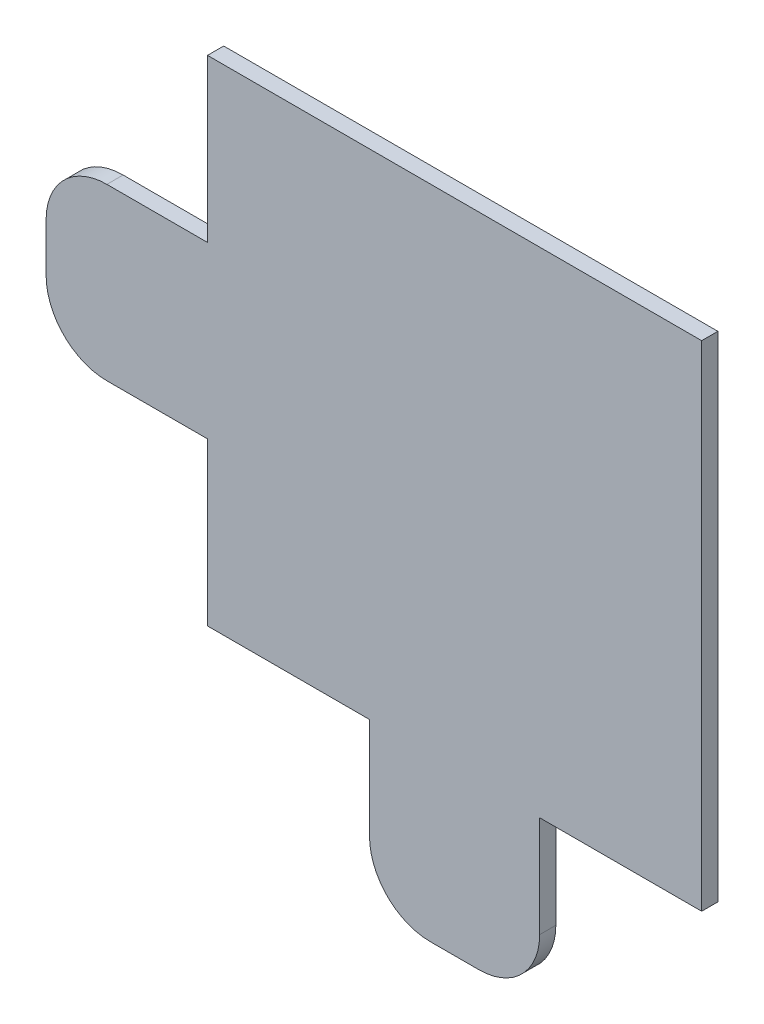
ISO-10303-21;
HEADER;
FILE_DESCRIPTION(('STEP AP214'),'2;1');
FILE_NAME('part.step','',(''),(''),'','','');
FILE_SCHEMA(('AUTOMOTIVE_DESIGN { 1 0 10303 214 1 1 1 1 }'));
ENDSEC;
DATA;
#1=APPLICATION_CONTEXT('core data for automotive mechanical design processes');
#2=APPLICATION_PROTOCOL_DEFINITION('international standard','automotive_design',2000,#1);
#3=PRODUCT_CONTEXT('',#1,'mechanical');
#4=PRODUCT('Part','Part','',(#3));
#5=PRODUCT_RELATED_PRODUCT_CATEGORY('part','',(#4));
#6=PRODUCT_DEFINITION_FORMATION('','',#4);
#7=PRODUCT_DEFINITION_CONTEXT('part definition',#1,'design');
#8=PRODUCT_DEFINITION('design','',#6,#7);
#9=PRODUCT_DEFINITION_SHAPE('','',#8);
#10=(LENGTH_UNIT() NAMED_UNIT(*) SI_UNIT(.MILLI.,.METRE.));
#11=(NAMED_UNIT(*) PLANE_ANGLE_UNIT() SI_UNIT($,.RADIAN.));
#12=(NAMED_UNIT(*) SI_UNIT($,.STERADIAN.) SOLID_ANGLE_UNIT());
#13=UNCERTAINTY_MEASURE_WITH_UNIT(LENGTH_MEASURE(1.E-05),#10,'distance_accuracy_value','');
#14=(GEOMETRIC_REPRESENTATION_CONTEXT(3) GLOBAL_UNCERTAINTY_ASSIGNED_CONTEXT((#13)) GLOBAL_UNIT_ASSIGNED_CONTEXT((#10,
#11,#12)) REPRESENTATION_CONTEXT('',''));
#15=CARTESIAN_POINT('',(0.,0.,0.));
#16=DIRECTION('',(0.,0.,1.));
#17=DIRECTION('',(1.,0.,0.));
#18=AXIS2_PLACEMENT_3D('',#15,#16,#17);
#19=CARTESIAN_POINT('',(-0.305,0.325,0.01));
#20=DIRECTION('',(0.,-1.,0.));
#21=DIRECTION('',(0.,0.,-1.));
#22=AXIS2_PLACEMENT_3D('',#19,#20,#21);
#23=PLANE('',#22);
#24=DIRECTION('',(-1.,0.,0.));
#25=VECTOR('',#24,1.);
#26=CARTESIAN_POINT('',(-0.305,0.325,-0.01));
#27=LINE('',#26,#25);
#28=CARTESIAN_POINT('',(0.305,0.325,-0.01));
#29=VERTEX_POINT('',#28);
#30=CARTESIAN_POINT('',(-0.305,0.325,-0.01));
#31=VERTEX_POINT('',#30);
#32=EDGE_CURVE('E177',#29,#31,#27,.T.);
#33=ORIENTED_EDGE('',*,*,#32,.T.);
#34=DIRECTION('',(0.,0.,-1.));
#35=VECTOR('',#34,1.);
#36=CARTESIAN_POINT('',(-0.305,0.325,0.01));
#37=LINE('',#36,#35);
#38=CARTESIAN_POINT('',(-0.305,0.325,0.01));
#39=VERTEX_POINT('',#38);
#40=EDGE_CURVE('E11',#39,#31,#37,.T.);
#41=ORIENTED_EDGE('',*,*,#40,.F.);
#42=DIRECTION('',(-1.,0.,0.));
#43=VECTOR('',#42,1.);
#44=CARTESIAN_POINT('',(-0.305,0.325,0.01));
#45=LINE('',#44,#43);
#46=CARTESIAN_POINT('',(0.305,0.325,0.01));
#47=VERTEX_POINT('',#46);
#48=EDGE_CURVE('E207',#47,#39,#45,.T.);
#49=ORIENTED_EDGE('',*,*,#48,.F.);
#50=DIRECTION('',(0.,0.,-1.));
#51=VECTOR('',#50,1.);
#52=CARTESIAN_POINT('',(0.305,0.325,0.01));
#53=LINE('',#52,#51);
#54=EDGE_CURVE('E173',#47,#29,#53,.T.);
#55=ORIENTED_EDGE('',*,*,#54,.T.);
#56=EDGE_LOOP('',(#33,#41,#49,#55));
#57=FACE_BOUND('',#56,.T.);
#58=ADVANCED_FACE('F33',(#57),#23,.F.);
#59=CARTESIAN_POINT('',(-0.305,0.325,0.01));
#60=DIRECTION('',(1.,0.,0.));
#61=DIRECTION('',(0.,0.,-1.));
#62=AXIS2_PLACEMENT_3D('',#59,#60,#61);
#63=PLANE('',#62);
#64=DIRECTION('',(0.,-1.,0.));
#65=VECTOR('',#64,1.);
#66=CARTESIAN_POINT('',(-0.305,0.325,-0.01));
#67=LINE('',#66,#65);
#68=CARTESIAN_POINT('',(-0.305,0.125,-0.01));
#69=VERTEX_POINT('',#68);
#70=EDGE_CURVE('E180',#31,#69,#67,.T.);
#71=ORIENTED_EDGE('',*,*,#70,.T.);
#72=DIRECTION('',(0.,0.,-1.));
#73=VECTOR('',#72,1.);
#74=CARTESIAN_POINT('',(-0.305,0.125,0.01));
#75=LINE('',#74,#73);
#76=CARTESIAN_POINT('',(-0.305,0.125,0.01));
#77=VERTEX_POINT('',#76);
#78=EDGE_CURVE('E41',#77,#69,#75,.T.);
#79=ORIENTED_EDGE('',*,*,#78,.F.);
#80=DIRECTION('',(0.,-1.,0.));
#81=VECTOR('',#80,1.);
#82=CARTESIAN_POINT('',(-0.305,0.325,0.01));
#83=LINE('',#82,#81);
#84=EDGE_CURVE('E116',#39,#77,#83,.T.);
#85=ORIENTED_EDGE('',*,*,#84,.F.);
#86=ORIENTED_EDGE('',*,*,#40,.T.);
#87=EDGE_LOOP('',(#71,#79,#85,#86));
#88=FACE_BOUND('',#87,.T.);
#89=ADVANCED_FACE('F305',(#88),#63,.F.);
#90=CARTESIAN_POINT('',(-0.429197649487811,0.125,0.01));
#91=DIRECTION('',(0.,-1.,0.));
#92=DIRECTION('',(0.,0.,-1.));
#93=AXIS2_PLACEMENT_3D('',#90,#91,#92);
#94=PLANE('',#93);
#95=DIRECTION('',(-1.,0.,0.));
#96=VECTOR('',#95,1.);
#97=CARTESIAN_POINT('',(-0.429197649487811,0.125,-0.01));
#98=LINE('',#97,#96);
#99=CARTESIAN_POINT('',(-0.429197649487811,0.125,-0.01));
#100=VERTEX_POINT('',#99);
#101=EDGE_CURVE('E182',#69,#100,#98,.T.);
#102=ORIENTED_EDGE('',*,*,#101,.T.);
#103=DIRECTION('',(0.,0.,-1.));
#104=VECTOR('',#103,1.);
#105=CARTESIAN_POINT('',(-0.429197649487811,0.125,0.01));
#106=LINE('',#105,#104);
#107=CARTESIAN_POINT('',(-0.429197649487811,0.125,0.01));
#108=VERTEX_POINT('',#107);
#109=EDGE_CURVE('E238',#108,#100,#106,.T.);
#110=ORIENTED_EDGE('',*,*,#109,.F.);
#111=DIRECTION('',(-1.,0.,0.));
#112=VECTOR('',#111,1.);
#113=CARTESIAN_POINT('',(-0.429197649487811,0.125,0.01));
#114=LINE('',#113,#112);
#115=EDGE_CURVE('E246',#77,#108,#114,.T.);
#116=ORIENTED_EDGE('',*,*,#115,.F.);
#117=ORIENTED_EDGE('',*,*,#78,.T.);
#118=EDGE_LOOP('',(#102,#110,#116,#117));
#119=FACE_BOUND('',#118,.T.);
#120=ADVANCED_FACE('F244',(#119),#94,.F.);
#121=CARTESIAN_POINT('',(-0.429197649487811,0.05,0.01));
#122=DIRECTION('',(0.,0.,-1.));
#123=DIRECTION('',(-1.,0.,0.));
#124=AXIS2_PLACEMENT_3D('',#121,#122,#123);
#125=CYLINDRICAL_SURFACE('',#124,0.075);
#126=CARTESIAN_POINT('',(-0.429197649487811,0.05,-0.01));
#127=DIRECTION('',(0.,0.,1.));
#128=DIRECTION('',(-1.,0.,0.));
#129=AXIS2_PLACEMENT_3D('',#126,#127,#128);
#130=CIRCLE('',#129,0.075);
#131=CARTESIAN_POINT('',(-0.504197649487811,0.05,-0.01));
#132=VERTEX_POINT('',#131);
#133=EDGE_CURVE('E184',#100,#132,#130,.T.);
#134=ORIENTED_EDGE('',*,*,#133,.T.);
#135=DIRECTION('',(0.,0.,-1.));
#136=VECTOR('',#135,1.);
#137=CARTESIAN_POINT('',(-0.504197649487811,0.05,0.01));
#138=LINE('',#137,#136);
#139=CARTESIAN_POINT('',(-0.504197649487811,0.05,0.01));
#140=VERTEX_POINT('',#139);
#141=EDGE_CURVE('E235',#140,#132,#138,.T.);
#142=ORIENTED_EDGE('',*,*,#141,.F.);
#143=CARTESIAN_POINT('',(-0.429197649487811,0.05,0.01));
#144=DIRECTION('',(0.,0.,1.));
#145=DIRECTION('',(-1.,0.,0.));
#146=AXIS2_PLACEMENT_3D('',#143,#144,#145);
#147=CIRCLE('',#146,0.075);
#148=EDGE_CURVE('E264',#108,#140,#147,.T.);
#149=ORIENTED_EDGE('',*,*,#148,.F.);
#150=ORIENTED_EDGE('',*,*,#109,.T.);
#151=EDGE_LOOP('',(#134,#142,#149,#150));
#152=FACE_BOUND('',#151,.T.);
#153=ADVANCED_FACE('F255',(#152),#125,.T.);
#154=CARTESIAN_POINT('',(-0.504197649487811,0.05,0.01));
#155=DIRECTION('',(1.,0.,0.));
#156=DIRECTION('',(0.,1.,0.));
#157=AXIS2_PLACEMENT_3D('',#154,#155,#156);
#158=PLANE('',#157);
#159=DIRECTION('',(0.,-1.,0.));
#160=VECTOR('',#159,1.);
#161=CARTESIAN_POINT('',(-0.504197649487811,0.05,-0.01));
#162=LINE('',#161,#160);
#163=CARTESIAN_POINT('',(-0.504197649487811,-0.00999999999999997,-0.01));
#164=VERTEX_POINT('',#163);
#165=EDGE_CURVE('E186',#132,#164,#162,.T.);
#166=ORIENTED_EDGE('',*,*,#165,.T.);
#167=DIRECTION('',(0.,0.,-1.));
#168=VECTOR('',#167,1.);
#169=CARTESIAN_POINT('',(-0.504197649487811,-0.00999999999999997,0.01));
#170=LINE('',#169,#168);
#171=CARTESIAN_POINT('',(-0.504197649487811,-0.00999999999999997,0.01));
#172=VERTEX_POINT('',#171);
#173=EDGE_CURVE('E232',#172,#164,#170,.T.);
#174=ORIENTED_EDGE('',*,*,#173,.F.);
#175=DIRECTION('',(0.,-1.,0.));
#176=VECTOR('',#175,1.);
#177=CARTESIAN_POINT('',(-0.504197649487811,0.05,0.01));
#178=LINE('',#177,#176);
#179=EDGE_CURVE('E261',#140,#172,#178,.T.);
#180=ORIENTED_EDGE('',*,*,#179,.F.);
#181=ORIENTED_EDGE('',*,*,#141,.T.);
#182=EDGE_LOOP('',(#166,#174,#180,#181));
#183=FACE_BOUND('',#182,.T.);
#184=ADVANCED_FACE('F259',(#183),#158,.F.);
#185=CARTESIAN_POINT('',(-0.429197649487811,-0.00999999999999997,0.01));
#186=DIRECTION('',(0.,0.,-1.));
#187=DIRECTION('',(-1.,0.,0.));
#188=AXIS2_PLACEMENT_3D('',#185,#186,#187);
#189=CYLINDRICAL_SURFACE('',#188,0.075);
#190=CARTESIAN_POINT('',(-0.429197649487811,-0.00999999999999997,-0.01));
#191=DIRECTION('',(0.,0.,1.));
#192=DIRECTION('',(-1.,0.,0.));
#193=AXIS2_PLACEMENT_3D('',#190,#191,#192);
#194=CIRCLE('',#193,0.075);
#195=CARTESIAN_POINT('',(-0.429197649487811,-0.085,-0.01));
#196=VERTEX_POINT('',#195);
#197=EDGE_CURVE('E188',#164,#196,#194,.T.);
#198=ORIENTED_EDGE('',*,*,#197,.T.);
#199=DIRECTION('',(0.,0.,-1.));
#200=VECTOR('',#199,1.);
#201=CARTESIAN_POINT('',(-0.429197649487811,-0.085,0.01));
#202=LINE('',#201,#200);
#203=CARTESIAN_POINT('',(-0.429197649487811,-0.085,0.01));
#204=VERTEX_POINT('',#203);
#205=EDGE_CURVE('E229',#204,#196,#202,.T.);
#206=ORIENTED_EDGE('',*,*,#205,.F.);
#207=CARTESIAN_POINT('',(-0.429197649487811,-0.00999999999999997,0.01));
#208=DIRECTION('',(0.,0.,1.));
#209=DIRECTION('',(-1.,0.,0.));
#210=AXIS2_PLACEMENT_3D('',#207,#208,#209);
#211=CIRCLE('',#210,0.075);
#212=EDGE_CURVE('E263',#172,#204,#211,.T.);
#213=ORIENTED_EDGE('',*,*,#212,.F.);
#214=ORIENTED_EDGE('',*,*,#173,.T.);
#215=EDGE_LOOP('',(#198,#206,#213,#214));
#216=FACE_BOUND('',#215,.T.);
#217=ADVANCED_FACE('F318',(#216),#189,.T.);
#218=CARTESIAN_POINT('',(-0.429197649487811,-0.085,0.01));
#219=DIRECTION('',(0.,1.,0.));
#220=DIRECTION('',(-1.,0.,0.));
#221=AXIS2_PLACEMENT_3D('',#218,#219,#220);
#222=PLANE('',#221);
#223=DIRECTION('',(1.,0.,0.));
#224=VECTOR('',#223,1.);
#225=CARTESIAN_POINT('',(-0.429197649487811,-0.085,-0.01));
#226=LINE('',#225,#224);
#227=CARTESIAN_POINT('',(-0.305,-0.085,-0.01));
#228=VERTEX_POINT('',#227);
#229=EDGE_CURVE('E190',#196,#228,#226,.T.);
#230=ORIENTED_EDGE('',*,*,#229,.T.);
#231=DIRECTION('',(0.,0.,-1.));
#232=VECTOR('',#231,1.);
#233=CARTESIAN_POINT('',(-0.305,-0.085,0.01));
#234=LINE('',#233,#232);
#235=CARTESIAN_POINT('',(-0.305,-0.085,0.01));
#236=VERTEX_POINT('',#235);
#237=EDGE_CURVE('E226',#236,#228,#234,.T.);
#238=ORIENTED_EDGE('',*,*,#237,.F.);
#239=DIRECTION('',(1.,0.,0.));
#240=VECTOR('',#239,1.);
#241=CARTESIAN_POINT('',(-0.429197649487811,-0.085,0.01));
#242=LINE('',#241,#240);
#243=EDGE_CURVE('E266',#204,#236,#242,.T.);
#244=ORIENTED_EDGE('',*,*,#243,.F.);
#245=ORIENTED_EDGE('',*,*,#205,.T.);
#246=EDGE_LOOP('',(#230,#238,#244,#245));
#247=FACE_BOUND('',#246,.T.);
#248=ADVANCED_FACE('F321',(#247),#222,.F.);
#249=CARTESIAN_POINT('',(-0.305,-0.085,0.01));
#250=DIRECTION('',(1.,0.,0.));
#251=DIRECTION('',(0.,0.,-1.));
#252=AXIS2_PLACEMENT_3D('',#249,#250,#251);
#253=PLANE('',#252);
#254=DIRECTION('',(0.,-1.,0.));
#255=VECTOR('',#254,1.);
#256=CARTESIAN_POINT('',(-0.305,-0.085,-0.01));
#257=LINE('',#256,#255);
#258=CARTESIAN_POINT('',(-0.305,-0.285,-0.01));
#259=VERTEX_POINT('',#258);
#260=EDGE_CURVE('E192',#228,#259,#257,.T.);
#261=ORIENTED_EDGE('',*,*,#260,.T.);
#262=DIRECTION('',(0.,0.,-1.));
#263=VECTOR('',#262,1.);
#264=CARTESIAN_POINT('',(-0.305,-0.285,0.01));
#265=LINE('',#264,#263);
#266=CARTESIAN_POINT('',(-0.305,-0.285,0.01));
#267=VERTEX_POINT('',#266);
#268=EDGE_CURVE('E223',#267,#259,#265,.T.);
#269=ORIENTED_EDGE('',*,*,#268,.F.);
#270=DIRECTION('',(0.,-1.,0.));
#271=VECTOR('',#270,1.);
#272=CARTESIAN_POINT('',(-0.305,-0.085,0.01));
#273=LINE('',#272,#271);
#274=EDGE_CURVE('E272',#236,#267,#273,.T.);
#275=ORIENTED_EDGE('',*,*,#274,.F.);
#276=ORIENTED_EDGE('',*,*,#237,.T.);
#277=EDGE_LOOP('',(#261,#269,#275,#276));
#278=FACE_BOUND('',#277,.T.);
#279=ADVANCED_FACE('F325',(#278),#253,.F.);
#280=CARTESIAN_POINT('',(-0.305,-0.285,0.01));
#281=DIRECTION('',(0.,1.,0.));
#282=DIRECTION('',(0.,0.,1.));
#283=AXIS2_PLACEMENT_3D('',#280,#281,#282);
#284=PLANE('',#283);
#285=DIRECTION('',(1.,0.,0.));
#286=VECTOR('',#285,1.);
#287=CARTESIAN_POINT('',(-0.305,-0.285,-0.01));
#288=LINE('',#287,#286);
#289=CARTESIAN_POINT('',(-0.105,-0.285,-0.01));
#290=VERTEX_POINT('',#289);
#291=EDGE_CURVE('E194',#259,#290,#288,.T.);
#292=ORIENTED_EDGE('',*,*,#291,.T.);
#293=DIRECTION('',(0.,0.,-1.));
#294=VECTOR('',#293,1.);
#295=CARTESIAN_POINT('',(-0.105,-0.285,0.01));
#296=LINE('',#295,#294);
#297=CARTESIAN_POINT('',(-0.105,-0.285,0.01));
#298=VERTEX_POINT('',#297);
#299=EDGE_CURVE('E220',#298,#290,#296,.T.);
#300=ORIENTED_EDGE('',*,*,#299,.F.);
#301=DIRECTION('',(1.,0.,0.));
#302=VECTOR('',#301,1.);
#303=CARTESIAN_POINT('',(-0.305,-0.285,0.01));
#304=LINE('',#303,#302);
#305=EDGE_CURVE('E274',#267,#298,#304,.T.);
#306=ORIENTED_EDGE('',*,*,#305,.F.);
#307=ORIENTED_EDGE('',*,*,#268,.T.);
#308=EDGE_LOOP('',(#292,#300,#306,#307));
#309=FACE_BOUND('',#308,.T.);
#310=ADVANCED_FACE('F329',(#309),#284,.F.);
#311=CARTESIAN_POINT('',(-0.105,-0.41,0.01));
#312=DIRECTION('',(1.,0.,0.));
#313=DIRECTION('',(0.,0.,-1.));
#314=AXIS2_PLACEMENT_3D('',#311,#312,#313);
#315=PLANE('',#314);
#316=DIRECTION('',(0.,-1.,0.));
#317=VECTOR('',#316,1.);
#318=CARTESIAN_POINT('',(-0.105,-0.41,-0.01));
#319=LINE('',#318,#317);
#320=CARTESIAN_POINT('',(-0.105,-0.41,-0.01));
#321=VERTEX_POINT('',#320);
#322=EDGE_CURVE('E196',#290,#321,#319,.T.);
#323=ORIENTED_EDGE('',*,*,#322,.T.);
#324=DIRECTION('',(0.,0.,-1.));
#325=VECTOR('',#324,1.);
#326=CARTESIAN_POINT('',(-0.105,-0.41,0.01));
#327=LINE('',#326,#325);
#328=CARTESIAN_POINT('',(-0.105,-0.41,0.01));
#329=VERTEX_POINT('',#328);
#330=EDGE_CURVE('E217',#329,#321,#327,.T.);
#331=ORIENTED_EDGE('',*,*,#330,.F.);
#332=DIRECTION('',(0.,-1.,0.));
#333=VECTOR('',#332,1.);
#334=CARTESIAN_POINT('',(-0.105,-0.41,0.01));
#335=LINE('',#334,#333);
#336=EDGE_CURVE('E276',#298,#329,#335,.T.);
#337=ORIENTED_EDGE('',*,*,#336,.F.);
#338=ORIENTED_EDGE('',*,*,#299,.T.);
#339=EDGE_LOOP('',(#323,#331,#337,#338));
#340=FACE_BOUND('',#339,.T.);
#341=ADVANCED_FACE('F333',(#340),#315,.F.);
#342=CARTESIAN_POINT('',(-0.0300000000000001,-0.41,0.01));
#343=DIRECTION('',(0.,0.,-1.));
#344=DIRECTION('',(-1.,0.,0.));
#345=AXIS2_PLACEMENT_3D('',#342,#343,#344);
#346=CYLINDRICAL_SURFACE('',#345,0.075);
#347=CARTESIAN_POINT('',(-0.0300000000000001,-0.41,-0.01));
#348=DIRECTION('',(0.,0.,1.));
#349=DIRECTION('',(1.,0.,0.));
#350=AXIS2_PLACEMENT_3D('',#347,#348,#349);
#351=CIRCLE('',#350,0.075);
#352=CARTESIAN_POINT('',(-0.0300000000000001,-0.485,-0.01));
#353=VERTEX_POINT('',#352);
#354=EDGE_CURVE('E198',#321,#353,#351,.T.);
#355=ORIENTED_EDGE('',*,*,#354,.T.);
#356=DIRECTION('',(0.,0.,-1.));
#357=VECTOR('',#356,1.);
#358=CARTESIAN_POINT('',(-0.0300000000000001,-0.485,0.01));
#359=LINE('',#358,#357);
#360=CARTESIAN_POINT('',(-0.0300000000000001,-0.485,0.01));
#361=VERTEX_POINT('',#360);
#362=EDGE_CURVE('E214',#361,#353,#359,.T.);
#363=ORIENTED_EDGE('',*,*,#362,.F.);
#364=CARTESIAN_POINT('',(-0.0300000000000001,-0.41,0.01));
#365=DIRECTION('',(0.,0.,1.));
#366=DIRECTION('',(1.,0.,0.));
#367=AXIS2_PLACEMENT_3D('',#364,#365,#366);
#368=CIRCLE('',#367,0.075);
#369=EDGE_CURVE('E278',#329,#361,#368,.T.);
#370=ORIENTED_EDGE('',*,*,#369,.F.);
#371=ORIENTED_EDGE('',*,*,#330,.T.);
#372=EDGE_LOOP('',(#355,#363,#370,#371));
#373=FACE_BOUND('',#372,.T.);
#374=ADVANCED_FACE('F337',(#373),#346,.T.);
#375=CARTESIAN_POINT('',(-0.0300000000000001,-0.485,0.01));
#376=DIRECTION('',(0.,1.,0.));
#377=DIRECTION('',(0.,0.,1.));
#378=AXIS2_PLACEMENT_3D('',#375,#376,#377);
#379=PLANE('',#378);
#380=DIRECTION('',(1.,0.,0.));
#381=VECTOR('',#380,1.);
#382=CARTESIAN_POINT('',(-0.0300000000000001,-0.485,-0.01));
#383=LINE('',#382,#381);
#384=CARTESIAN_POINT('',(0.0299999999999998,-0.485,-0.01));
#385=VERTEX_POINT('',#384);
#386=EDGE_CURVE('E200',#353,#385,#383,.T.);
#387=ORIENTED_EDGE('',*,*,#386,.T.);
#388=DIRECTION('',(0.,0.,-1.));
#389=VECTOR('',#388,1.);
#390=CARTESIAN_POINT('',(0.0299999999999998,-0.485,0.01));
#391=LINE('',#390,#389);
#392=CARTESIAN_POINT('',(0.0299999999999998,-0.485,0.01));
#393=VERTEX_POINT('',#392);
#394=EDGE_CURVE('E211',#393,#385,#391,.T.);
#395=ORIENTED_EDGE('',*,*,#394,.F.);
#396=DIRECTION('',(1.,0.,0.));
#397=VECTOR('',#396,1.);
#398=CARTESIAN_POINT('',(-0.0300000000000001,-0.485,0.01));
#399=LINE('',#398,#397);
#400=EDGE_CURVE('E280',#361,#393,#399,.T.);
#401=ORIENTED_EDGE('',*,*,#400,.F.);
#402=ORIENTED_EDGE('',*,*,#362,.T.);
#403=EDGE_LOOP('',(#387,#395,#401,#402));
#404=FACE_BOUND('',#403,.T.);
#405=ADVANCED_FACE('F286',(#404),#379,.F.);
#406=CARTESIAN_POINT('',(0.0299999999999998,-0.41,0.01));
#407=DIRECTION('',(0.,0.,-1.));
#408=DIRECTION('',(-1.,0.,0.));
#409=AXIS2_PLACEMENT_3D('',#406,#407,#408);
#410=CYLINDRICAL_SURFACE('',#409,0.075);
#411=CARTESIAN_POINT('',(0.0299999999999998,-0.41,-0.01));
#412=DIRECTION('',(0.,0.,1.));
#413=DIRECTION('',(-1.,0.,0.));
#414=AXIS2_PLACEMENT_3D('',#411,#412,#413);
#415=CIRCLE('',#414,0.075);
#416=CARTESIAN_POINT('',(0.105,-0.41,-0.01));
#417=VERTEX_POINT('',#416);
#418=EDGE_CURVE('E202',#385,#417,#415,.T.);
#419=ORIENTED_EDGE('',*,*,#418,.T.);
#420=DIRECTION('',(0.,0.,-1.));
#421=VECTOR('',#420,1.);
#422=CARTESIAN_POINT('',(0.105,-0.41,0.01));
#423=LINE('',#422,#421);
#424=CARTESIAN_POINT('',(0.105,-0.41,0.01));
#425=VERTEX_POINT('',#424);
#426=EDGE_CURVE('E168',#425,#417,#423,.T.);
#427=ORIENTED_EDGE('',*,*,#426,.F.);
#428=CARTESIAN_POINT('',(0.0299999999999998,-0.41,0.01));
#429=DIRECTION('',(0.,0.,1.));
#430=DIRECTION('',(-1.,0.,0.));
#431=AXIS2_PLACEMENT_3D('',#428,#429,#430);
#432=CIRCLE('',#431,0.075);
#433=EDGE_CURVE('E159',#393,#425,#432,.T.);
#434=ORIENTED_EDGE('',*,*,#433,.F.);
#435=ORIENTED_EDGE('',*,*,#394,.T.);
#436=EDGE_LOOP('',(#419,#427,#434,#435));
#437=FACE_BOUND('',#436,.T.);
#438=ADVANCED_FACE('F290',(#437),#410,.T.);
#439=CARTESIAN_POINT('',(0.105,-0.41,0.01));
#440=DIRECTION('',(-1.,0.,0.));
#441=DIRECTION('',(0.,-1.,0.));
#442=AXIS2_PLACEMENT_3D('',#439,#440,#441);
#443=PLANE('',#442);
#444=DIRECTION('',(0.,1.,0.));
#445=VECTOR('',#444,1.);
#446=CARTESIAN_POINT('',(0.105,-0.41,-0.01));
#447=LINE('',#446,#445);
#448=CARTESIAN_POINT('',(0.105,-0.285,-0.01));
#449=VERTEX_POINT('',#448);
#450=EDGE_CURVE('E167',#417,#449,#447,.T.);
#451=ORIENTED_EDGE('',*,*,#450,.T.);
#452=DIRECTION('',(0.,0.,-1.));
#453=VECTOR('',#452,1.);
#454=CARTESIAN_POINT('',(0.105,-0.285,0.01));
#455=LINE('',#454,#453);
#456=CARTESIAN_POINT('',(0.105,-0.285,0.01));
#457=VERTEX_POINT('',#456);
#458=EDGE_CURVE('E164',#457,#449,#455,.T.);
#459=ORIENTED_EDGE('',*,*,#458,.F.);
#460=DIRECTION('',(0.,1.,0.));
#461=VECTOR('',#460,1.);
#462=CARTESIAN_POINT('',(0.105,-0.41,0.01));
#463=LINE('',#462,#461);
#464=EDGE_CURVE('E153',#425,#457,#463,.T.);
#465=ORIENTED_EDGE('',*,*,#464,.F.);
#466=ORIENTED_EDGE('',*,*,#426,.T.);
#467=EDGE_LOOP('',(#451,#459,#465,#466));
#468=FACE_BOUND('',#467,.T.);
#469=ADVANCED_FACE('F165',(#468),#443,.F.);
#470=CARTESIAN_POINT('',(0.105,-0.285,0.01));
#471=DIRECTION('',(0.,1.,0.));
#472=DIRECTION('',(-1.,0.,0.));
#473=AXIS2_PLACEMENT_3D('',#470,#471,#472);
#474=PLANE('',#473);
#475=DIRECTION('',(1.,0.,0.));
#476=VECTOR('',#475,1.);
#477=CARTESIAN_POINT('',(0.105,-0.285,-0.01));
#478=LINE('',#477,#476);
#479=CARTESIAN_POINT('',(0.305,-0.285,-0.01));
#480=VERTEX_POINT('',#479);
#481=EDGE_CURVE('E102',#449,#480,#478,.T.);
#482=ORIENTED_EDGE('',*,*,#481,.T.);
#483=DIRECTION('',(0.,0.,-1.));
#484=VECTOR('',#483,1.);
#485=CARTESIAN_POINT('',(0.305,-0.285,0.01));
#486=LINE('',#485,#484);
#487=CARTESIAN_POINT('',(0.305,-0.285,0.01));
#488=VERTEX_POINT('',#487);
#489=EDGE_CURVE('E169',#488,#480,#486,.T.);
#490=ORIENTED_EDGE('',*,*,#489,.F.);
#491=DIRECTION('',(1.,0.,0.));
#492=VECTOR('',#491,1.);
#493=CARTESIAN_POINT('',(0.105,-0.285,0.01));
#494=LINE('',#493,#492);
#495=EDGE_CURVE('E157',#457,#488,#494,.T.);
#496=ORIENTED_EDGE('',*,*,#495,.F.);
#497=ORIENTED_EDGE('',*,*,#458,.T.);
#498=EDGE_LOOP('',(#482,#490,#496,#497));
#499=FACE_BOUND('',#498,.T.);
#500=ADVANCED_FACE('F171',(#499),#474,.F.);
#501=CARTESIAN_POINT('',(0.305,0.325,0.01));
#502=DIRECTION('',(-1.,0.,0.));
#503=DIRECTION('',(0.,-1.,0.));
#504=AXIS2_PLACEMENT_3D('',#501,#502,#503);
#505=PLANE('',#504);
#506=DIRECTION('',(0.,1.,0.));
#507=VECTOR('',#506,1.);
#508=CARTESIAN_POINT('',(0.305,0.325,-0.01));
#509=LINE('',#508,#507);
#510=EDGE_CURVE('E108',#480,#29,#509,.T.);
#511=ORIENTED_EDGE('',*,*,#510,.T.);
#512=ORIENTED_EDGE('',*,*,#54,.F.);
#513=DIRECTION('',(0.,1.,0.));
#514=VECTOR('',#513,1.);
#515=CARTESIAN_POINT('',(0.305,0.325,0.01));
#516=LINE('',#515,#514);
#517=EDGE_CURVE('E49',#488,#47,#516,.T.);
#518=ORIENTED_EDGE('',*,*,#517,.F.);
#519=ORIENTED_EDGE('',*,*,#489,.T.);
#520=EDGE_LOOP('',(#511,#512,#518,#519));
#521=FACE_BOUND('',#520,.T.);
#522=ADVANCED_FACE('F294',(#521),#505,.F.);
#523=CARTESIAN_POINT('',(0.0299999999999998,-0.41,0.01));
#524=DIRECTION('',(0.,0.,-1.));
#525=DIRECTION('',(-1.,0.,0.));
#526=AXIS2_PLACEMENT_3D('',#523,#524,#525);
#527=PLANE('',#526);
#528=ORIENTED_EDGE('',*,*,#48,.T.);
#529=ORIENTED_EDGE('',*,*,#84,.T.);
#530=ORIENTED_EDGE('',*,*,#115,.T.);
#531=ORIENTED_EDGE('',*,*,#148,.T.);
#532=ORIENTED_EDGE('',*,*,#179,.T.);
#533=ORIENTED_EDGE('',*,*,#212,.T.);
#534=ORIENTED_EDGE('',*,*,#243,.T.);
#535=ORIENTED_EDGE('',*,*,#274,.T.);
#536=ORIENTED_EDGE('',*,*,#305,.T.);
#537=ORIENTED_EDGE('',*,*,#336,.T.);
#538=ORIENTED_EDGE('',*,*,#369,.T.);
#539=ORIENTED_EDGE('',*,*,#400,.T.);
#540=ORIENTED_EDGE('',*,*,#433,.T.);
#541=ORIENTED_EDGE('',*,*,#464,.T.);
#542=ORIENTED_EDGE('',*,*,#495,.T.);
#543=ORIENTED_EDGE('',*,*,#517,.T.);
#544=EDGE_LOOP('',(#528,#529,#530,#531,#532,#533,#534,#535,#536,#537,#538,#539,#540,#541,#542,#543));
#545=FACE_BOUND('',#544,.T.);
#546=ADVANCED_FACE('F155',(#545),#527,.F.);
#547=CARTESIAN_POINT('',(0.0299999999999998,-0.41,-0.01));
#548=DIRECTION('',(0.,0.,-1.));
#549=DIRECTION('',(-1.,0.,0.));
#550=AXIS2_PLACEMENT_3D('',#547,#548,#549);
#551=PLANE('',#550);
#552=ORIENTED_EDGE('',*,*,#32,.F.);
#553=ORIENTED_EDGE('',*,*,#510,.F.);
#554=ORIENTED_EDGE('',*,*,#481,.F.);
#555=ORIENTED_EDGE('',*,*,#450,.F.);
#556=ORIENTED_EDGE('',*,*,#418,.F.);
#557=ORIENTED_EDGE('',*,*,#386,.F.);
#558=ORIENTED_EDGE('',*,*,#354,.F.);
#559=ORIENTED_EDGE('',*,*,#322,.F.);
#560=ORIENTED_EDGE('',*,*,#291,.F.);
#561=ORIENTED_EDGE('',*,*,#260,.F.);
#562=ORIENTED_EDGE('',*,*,#229,.F.);
#563=ORIENTED_EDGE('',*,*,#197,.F.);
#564=ORIENTED_EDGE('',*,*,#165,.F.);
#565=ORIENTED_EDGE('',*,*,#133,.F.);
#566=ORIENTED_EDGE('',*,*,#101,.F.);
#567=ORIENTED_EDGE('',*,*,#70,.F.);
#568=EDGE_LOOP('',(#552,#553,#554,#555,#556,#557,#558,#559,#560,#561,#562,#563,#564,#565,#566,#567));
#569=FACE_BOUND('',#568,.T.);
#570=ADVANCED_FACE('F250',(#569),#551,.T.);
#571=CLOSED_SHELL('',(#58,#89,#120,#153,#184,#217,#248,#279,#310,#341,#374,#405,#438,#469,#500,
#522,#546,#570));
#572=MANIFOLD_SOLID_BREP('B2',#571);
#573=ADVANCED_BREP_SHAPE_REPRESENTATION('',(#18,#572),#14);
#574=SHAPE_DEFINITION_REPRESENTATION(#9,#573);
ENDSEC;
END-ISO-10303-21;
